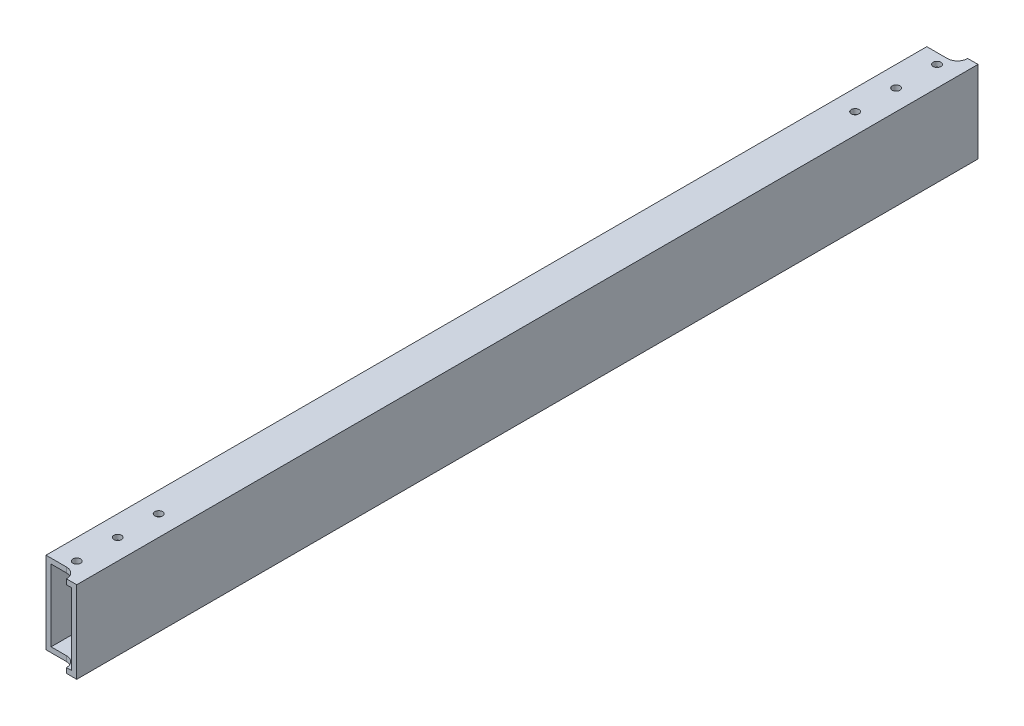
ISO-10303-21;
HEADER;
FILE_DESCRIPTION(('STEP AP214'),'2;1');
FILE_NAME('part.step','',(''),(''),'','','');
FILE_SCHEMA(('AUTOMOTIVE_DESIGN { 1 0 10303 214 1 1 1 1 }'));
ENDSEC;
DATA;
#1=APPLICATION_CONTEXT('core data for automotive mechanical design processes');
#2=APPLICATION_PROTOCOL_DEFINITION('international standard','automotive_design',2000,#1);
#3=PRODUCT_CONTEXT('',#1,'mechanical');
#4=PRODUCT('Part','Part','',(#3));
#5=PRODUCT_RELATED_PRODUCT_CATEGORY('part','',(#4));
#6=PRODUCT_DEFINITION_FORMATION('','',#4);
#7=PRODUCT_DEFINITION_CONTEXT('part definition',#1,'design');
#8=PRODUCT_DEFINITION('design','',#6,#7);
#9=PRODUCT_DEFINITION_SHAPE('','',#8);
#10=(LENGTH_UNIT() NAMED_UNIT(*) SI_UNIT(.MILLI.,.METRE.));
#11=(NAMED_UNIT(*) PLANE_ANGLE_UNIT() SI_UNIT($,.RADIAN.));
#12=(NAMED_UNIT(*) SI_UNIT($,.STERADIAN.) SOLID_ANGLE_UNIT());
#13=UNCERTAINTY_MEASURE_WITH_UNIT(LENGTH_MEASURE(1.E-05),#10,'distance_accuracy_value','');
#14=(GEOMETRIC_REPRESENTATION_CONTEXT(3) GLOBAL_UNCERTAINTY_ASSIGNED_CONTEXT((#13)) GLOBAL_UNIT_ASSIGNED_CONTEXT((#10,
#11,#12)) REPRESENTATION_CONTEXT('',''));
#15=CARTESIAN_POINT('',(0.,0.,0.));
#16=DIRECTION('',(0.,0.,1.));
#17=DIRECTION('',(1.,0.,0.));
#18=AXIS2_PLACEMENT_3D('',#15,#16,#17);
#19=CARTESIAN_POINT('',(12.7,25.4,279.4));
#20=DIRECTION('',(-1.,0.,0.));
#21=DIRECTION('',(0.,0.,1.));
#22=AXIS2_PLACEMENT_3D('',#19,#20,#21);
#23=PLANE('',#22);
#24=DIRECTION('',(0.,1.,0.));
#25=VECTOR('',#24,1.);
#26=CARTESIAN_POINT('',(12.7,25.4,-279.4));
#27=LINE('',#26,#25);
#28=CARTESIAN_POINT('',(12.7,-25.4,-279.4));
#29=VERTEX_POINT('',#28);
#30=CARTESIAN_POINT('',(12.7,25.4,-279.4));
#31=VERTEX_POINT('',#30);
#32=EDGE_CURVE('E181',#29,#31,#27,.T.);
#33=ORIENTED_EDGE('',*,*,#32,.T.);
#34=DIRECTION('',(0.,0.,-1.));
#35=VECTOR('',#34,1.);
#36=CARTESIAN_POINT('',(12.7,25.4,279.4));
#37=LINE('',#36,#35);
#38=CARTESIAN_POINT('',(12.7,25.4,279.4));
#39=VERTEX_POINT('',#38);
#40=EDGE_CURVE('E178',#39,#31,#37,.T.);
#41=ORIENTED_EDGE('',*,*,#40,.F.);
#42=DIRECTION('',(0.,1.,0.));
#43=VECTOR('',#42,1.);
#44=CARTESIAN_POINT('',(12.7,25.4,279.4));
#45=LINE('',#44,#43);
#46=CARTESIAN_POINT('',(12.7,-25.4,279.4));
#47=VERTEX_POINT('',#46);
#48=EDGE_CURVE('E183',#47,#39,#45,.T.);
#49=ORIENTED_EDGE('',*,*,#48,.F.);
#50=DIRECTION('',(0.,0.,-1.));
#51=VECTOR('',#50,1.);
#52=CARTESIAN_POINT('',(12.7,-25.4,279.4));
#53=LINE('',#52,#51);
#54=EDGE_CURVE('E189',#47,#29,#53,.T.);
#55=ORIENTED_EDGE('',*,*,#54,.T.);
#56=EDGE_LOOP('',(#33,#41,#49,#55));
#57=FACE_BOUND('',#56,.T.);
#58=ADVANCED_FACE('F39',(#57),#23,.F.);
#59=CARTESIAN_POINT('',(-12.7,25.4,279.4));
#60=DIRECTION('',(0.,-1.,0.));
#61=DIRECTION('',(0.,0.,-1.));
#62=AXIS2_PLACEMENT_3D('',#59,#60,#61);
#63=PLANE('',#62);
#64=CARTESIAN_POINT('',(0.,25.4,241.3));
#65=DIRECTION('',(0.,1.,0.));
#66=DIRECTION('',(0.,0.,-1.));
#67=AXIS2_PLACEMENT_3D('',#64,#65,#66);
#68=CIRCLE('',#67,2.38125000000003);
#69=CARTESIAN_POINT('',(0.,25.4,238.91875));
#70=VERTEX_POINT('',#69);
#71=EDGE_CURVE('E326',#70,#70,#68,.T.);
#72=ORIENTED_EDGE('',*,*,#71,.F.);
#73=EDGE_LOOP('',(#72));
#74=FACE_BOUND('',#73,.T.);
#75=CARTESIAN_POINT('',(0.,25.4,266.7));
#76=DIRECTION('',(0.,1.,0.));
#77=DIRECTION('',(0.,0.,-1.));
#78=AXIS2_PLACEMENT_3D('',#75,#76,#77);
#79=CIRCLE('',#78,2.38125000000004);
#80=CARTESIAN_POINT('',(0.,25.4,264.31875));
#81=VERTEX_POINT('',#80);
#82=EDGE_CURVE('E327',#81,#81,#79,.T.);
#83=ORIENTED_EDGE('',*,*,#82,.F.);
#84=EDGE_LOOP('',(#83));
#85=FACE_BOUND('',#84,.T.);
#86=CARTESIAN_POINT('',(0.,25.4,215.9));
#87=DIRECTION('',(0.,1.,0.));
#88=DIRECTION('',(0.,0.,-1.));
#89=AXIS2_PLACEMENT_3D('',#86,#87,#88);
#90=CIRCLE('',#89,2.38125000000001);
#91=CARTESIAN_POINT('',(0.,25.4,213.51875));
#92=VERTEX_POINT('',#91);
#93=EDGE_CURVE('E355',#92,#92,#90,.T.);
#94=ORIENTED_EDGE('',*,*,#93,.F.);
#95=EDGE_LOOP('',(#94));
#96=FACE_BOUND('',#95,.T.);
#97=CARTESIAN_POINT('',(0.,25.4,-215.9));
#98=DIRECTION('',(0.,1.,0.));
#99=DIRECTION('',(0.,0.,1.));
#100=AXIS2_PLACEMENT_3D('',#97,#98,#99);
#101=CIRCLE('',#100,2.38125000000001);
#102=CARTESIAN_POINT('',(0.,25.4,-213.51875));
#103=VERTEX_POINT('',#102);
#104=EDGE_CURVE('E361',#103,#103,#101,.T.);
#105=ORIENTED_EDGE('',*,*,#104,.F.);
#106=EDGE_LOOP('',(#105));
#107=FACE_BOUND('',#106,.T.);
#108=CARTESIAN_POINT('',(0.,25.4,-241.3));
#109=DIRECTION('',(0.,1.,0.));
#110=DIRECTION('',(0.,0.,1.));
#111=AXIS2_PLACEMENT_3D('',#108,#109,#110);
#112=CIRCLE('',#111,2.38125000000003);
#113=CARTESIAN_POINT('',(0.,25.4,-238.91875));
#114=VERTEX_POINT('',#113);
#115=EDGE_CURVE('E173',#114,#114,#112,.T.);
#116=ORIENTED_EDGE('',*,*,#115,.F.);
#117=EDGE_LOOP('',(#116));
#118=FACE_BOUND('',#117,.T.);
#119=CARTESIAN_POINT('',(0.,25.4,-266.7));
#120=DIRECTION('',(0.,1.,0.));
#121=DIRECTION('',(0.,0.,1.));
#122=AXIS2_PLACEMENT_3D('',#119,#120,#121);
#123=CIRCLE('',#122,2.38125000000004);
#124=CARTESIAN_POINT('',(0.,25.4,-264.31875));
#125=VERTEX_POINT('',#124);
#126=EDGE_CURVE('E318',#125,#125,#123,.T.);
#127=ORIENTED_EDGE('',*,*,#126,.F.);
#128=EDGE_LOOP('',(#127));
#129=FACE_BOUND('',#128,.T.);
#130=DIRECTION('',(-1.,0.,0.));
#131=VECTOR('',#130,1.);
#132=CARTESIAN_POINT('',(-12.7,25.4,273.05));
#133=LINE('',#132,#131);
#134=CARTESIAN_POINT('',(0.,25.4,273.05));
#135=VERTEX_POINT('',#134);
#136=CARTESIAN_POINT('',(-12.7,25.4,273.05));
#137=VERTEX_POINT('',#136);
#138=EDGE_CURVE('E333',#135,#137,#133,.T.);
#139=ORIENTED_EDGE('',*,*,#138,.F.);
#140=CARTESIAN_POINT('',(0.,25.4,279.4));
#141=DIRECTION('',(0.,1.,0.));
#142=DIRECTION('',(0.,0.,1.));
#143=AXIS2_PLACEMENT_3D('',#140,#141,#142);
#144=CIRCLE('',#143,6.35000000000001);
#145=CARTESIAN_POINT('',(6.35,25.4,279.4));
#146=VERTEX_POINT('',#145);
#147=EDGE_CURVE('E337',#146,#135,#144,.T.);
#148=ORIENTED_EDGE('',*,*,#147,.F.);
#149=DIRECTION('',(-1.,0.,0.));
#150=VECTOR('',#149,1.);
#151=CARTESIAN_POINT('',(-12.7,25.4,279.4));
#152=LINE('',#151,#150);
#153=EDGE_CURVE('E270',#39,#146,#152,.T.);
#154=ORIENTED_EDGE('',*,*,#153,.F.);
#155=ORIENTED_EDGE('',*,*,#40,.T.);
#156=DIRECTION('',(-1.,0.,0.));
#157=VECTOR('',#156,1.);
#158=CARTESIAN_POINT('',(-12.7,25.4,-279.4));
#159=LINE('',#158,#157);
#160=CARTESIAN_POINT('',(6.35,25.4,-279.4));
#161=VERTEX_POINT('',#160);
#162=EDGE_CURVE('E168',#31,#161,#159,.T.);
#163=ORIENTED_EDGE('',*,*,#162,.T.);
#164=CARTESIAN_POINT('',(0.,25.4,-279.4));
#165=DIRECTION('',(0.,1.,0.));
#166=DIRECTION('',(0.,0.,-1.));
#167=AXIS2_PLACEMENT_3D('',#164,#165,#166);
#168=CIRCLE('',#167,6.35000000000001);
#169=CARTESIAN_POINT('',(0.,25.4,-273.05));
#170=VERTEX_POINT('',#169);
#171=EDGE_CURVE('E149',#170,#161,#168,.T.);
#172=ORIENTED_EDGE('',*,*,#171,.F.);
#173=DIRECTION('',(1.,0.,0.));
#174=VECTOR('',#173,1.);
#175=CARTESIAN_POINT('',(-12.7,25.4,-273.05));
#176=LINE('',#175,#174);
#177=CARTESIAN_POINT('',(-12.7,25.4,-273.05));
#178=VERTEX_POINT('',#177);
#179=EDGE_CURVE('E160',#178,#170,#176,.T.);
#180=ORIENTED_EDGE('',*,*,#179,.F.);
#181=DIRECTION('',(0.,0.,-1.));
#182=VECTOR('',#181,1.);
#183=CARTESIAN_POINT('',(-12.7,25.4,279.4));
#184=LINE('',#183,#182);
#185=EDGE_CURVE('E196',#137,#178,#184,.T.);
#186=ORIENTED_EDGE('',*,*,#185,.F.);
#187=EDGE_LOOP('',(#139,#148,#154,#155,#163,#172,#180,#186));
#188=FACE_BOUND('',#187,.T.);
#189=ADVANCED_FACE('F176',(#74,#85,#96,#107,#118,#129,#188),#63,.F.);
#190=CARTESIAN_POINT('',(-12.7,25.4,279.4));
#191=DIRECTION('',(1.,0.,0.));
#192=DIRECTION('',(0.,0.,-1.));
#193=AXIS2_PLACEMENT_3D('',#190,#191,#192);
#194=PLANE('',#193);
#195=DIRECTION('',(0.,0.,-1.));
#196=VECTOR('',#195,1.);
#197=CARTESIAN_POINT('',(-12.7,-25.4,279.4));
#198=LINE('',#197,#196);
#199=CARTESIAN_POINT('',(-12.7,-25.4,273.05));
#200=VERTEX_POINT('',#199);
#201=CARTESIAN_POINT('',(-12.7,-25.4,-273.05));
#202=VERTEX_POINT('',#201);
#203=EDGE_CURVE('E192',#200,#202,#198,.T.);
#204=ORIENTED_EDGE('',*,*,#203,.F.);
#205=DIRECTION('',(0.,1.,0.));
#206=VECTOR('',#205,1.);
#207=CARTESIAN_POINT('',(-12.7,-25.4,273.05));
#208=LINE('',#207,#206);
#209=EDGE_CURVE('E343',#200,#137,#208,.T.);
#210=ORIENTED_EDGE('',*,*,#209,.T.);
#211=ORIENTED_EDGE('',*,*,#185,.T.);
#212=DIRECTION('',(0.,1.,0.));
#213=VECTOR('',#212,1.);
#214=CARTESIAN_POINT('',(-12.7,-25.4,-273.05));
#215=LINE('',#214,#213);
#216=EDGE_CURVE('E373',#202,#178,#215,.T.);
#217=ORIENTED_EDGE('',*,*,#216,.F.);
#218=EDGE_LOOP('',(#204,#210,#211,#217));
#219=FACE_BOUND('',#218,.T.);
#220=ADVANCED_FACE('F383',(#219),#194,.F.);
#221=CARTESIAN_POINT('',(-12.7,-25.4,279.4));
#222=DIRECTION('',(0.,1.,0.));
#223=DIRECTION('',(0.,0.,1.));
#224=AXIS2_PLACEMENT_3D('',#221,#222,#223);
#225=PLANE('',#224);
#226=CARTESIAN_POINT('',(0.,-25.4,241.3));
#227=DIRECTION('',(0.,1.,0.));
#228=DIRECTION('',(0.,0.,-1.));
#229=AXIS2_PLACEMENT_3D('',#226,#227,#228);
#230=CIRCLE('',#229,2.38125000000003);
#231=CARTESIAN_POINT('',(0.,-25.4,238.91875));
#232=VERTEX_POINT('',#231);
#233=EDGE_CURVE('E323',#232,#232,#230,.T.);
#234=ORIENTED_EDGE('',*,*,#233,.T.);
#235=EDGE_LOOP('',(#234));
#236=FACE_BOUND('',#235,.T.);
#237=CARTESIAN_POINT('',(0.,-25.4,266.7));
#238=DIRECTION('',(0.,1.,0.));
#239=DIRECTION('',(0.,0.,-1.));
#240=AXIS2_PLACEMENT_3D('',#237,#238,#239);
#241=CIRCLE('',#240,2.38125000000004);
#242=CARTESIAN_POINT('',(0.,-25.4,264.31875));
#243=VERTEX_POINT('',#242);
#244=EDGE_CURVE('E348',#243,#243,#241,.T.);
#245=ORIENTED_EDGE('',*,*,#244,.T.);
#246=EDGE_LOOP('',(#245));
#247=FACE_BOUND('',#246,.T.);
#248=CARTESIAN_POINT('',(0.,-25.4,215.9));
#249=DIRECTION('',(0.,1.,0.));
#250=DIRECTION('',(0.,0.,-1.));
#251=AXIS2_PLACEMENT_3D('',#248,#249,#250);
#252=CIRCLE('',#251,2.38125000000001);
#253=CARTESIAN_POINT('',(0.,-25.4,213.51875));
#254=VERTEX_POINT('',#253);
#255=EDGE_CURVE('E340',#254,#254,#252,.T.);
#256=ORIENTED_EDGE('',*,*,#255,.T.);
#257=EDGE_LOOP('',(#256));
#258=FACE_BOUND('',#257,.T.);
#259=CARTESIAN_POINT('',(0.,-25.4,-215.9));
#260=DIRECTION('',(0.,1.,0.));
#261=DIRECTION('',(0.,0.,1.));
#262=AXIS2_PLACEMENT_3D('',#259,#260,#261);
#263=CIRCLE('',#262,2.38125000000001);
#264=CARTESIAN_POINT('',(0.,-25.4,-213.51875));
#265=VERTEX_POINT('',#264);
#266=EDGE_CURVE('E358',#265,#265,#263,.T.);
#267=ORIENTED_EDGE('',*,*,#266,.T.);
#268=EDGE_LOOP('',(#267));
#269=FACE_BOUND('',#268,.T.);
#270=CARTESIAN_POINT('',(0.,-25.4,-241.3));
#271=DIRECTION('',(0.,1.,0.));
#272=DIRECTION('',(0.,0.,1.));
#273=AXIS2_PLACEMENT_3D('',#270,#271,#272);
#274=CIRCLE('',#273,2.38125000000003);
#275=CARTESIAN_POINT('',(0.,-25.4,-238.91875));
#276=VERTEX_POINT('',#275);
#277=EDGE_CURVE('E364',#276,#276,#274,.T.);
#278=ORIENTED_EDGE('',*,*,#277,.T.);
#279=EDGE_LOOP('',(#278));
#280=FACE_BOUND('',#279,.T.);
#281=CARTESIAN_POINT('',(0.,-25.4,-266.7));
#282=DIRECTION('',(0.,1.,0.));
#283=DIRECTION('',(0.,0.,1.));
#284=AXIS2_PLACEMENT_3D('',#281,#282,#283);
#285=CIRCLE('',#284,2.38125000000004);
#286=CARTESIAN_POINT('',(0.,-25.4,-264.31875));
#287=VERTEX_POINT('',#286);
#288=EDGE_CURVE('E205',#287,#287,#285,.T.);
#289=ORIENTED_EDGE('',*,*,#288,.T.);
#290=EDGE_LOOP('',(#289));
#291=FACE_BOUND('',#290,.T.);
#292=DIRECTION('',(1.,0.,0.));
#293=VECTOR('',#292,1.);
#294=CARTESIAN_POINT('',(-12.7,-25.4,279.4));
#295=LINE('',#294,#293);
#296=CARTESIAN_POINT('',(6.35,-25.4,279.4));
#297=VERTEX_POINT('',#296);
#298=EDGE_CURVE('E193',#297,#47,#295,.T.);
#299=ORIENTED_EDGE('',*,*,#298,.F.);
#300=CARTESIAN_POINT('',(0.,-25.4,279.4));
#301=DIRECTION('',(0.,1.,0.));
#302=DIRECTION('',(0.,0.,1.));
#303=AXIS2_PLACEMENT_3D('',#300,#301,#302);
#304=CIRCLE('',#303,6.35000000000001);
#305=CARTESIAN_POINT('',(0.,-25.4,273.05));
#306=VERTEX_POINT('',#305);
#307=EDGE_CURVE('E331',#297,#306,#304,.T.);
#308=ORIENTED_EDGE('',*,*,#307,.T.);
#309=DIRECTION('',(-1.,0.,0.));
#310=VECTOR('',#309,1.);
#311=CARTESIAN_POINT('',(-12.7,-25.4,273.05));
#312=LINE('',#311,#310);
#313=EDGE_CURVE('E334',#306,#200,#312,.T.);
#314=ORIENTED_EDGE('',*,*,#313,.T.);
#315=ORIENTED_EDGE('',*,*,#203,.T.);
#316=DIRECTION('',(1.,0.,0.));
#317=VECTOR('',#316,1.);
#318=CARTESIAN_POINT('',(-12.7,-25.4,-273.05));
#319=LINE('',#318,#317);
#320=CARTESIAN_POINT('',(0.,-25.4,-273.05));
#321=VERTEX_POINT('',#320);
#322=EDGE_CURVE('E161',#202,#321,#319,.T.);
#323=ORIENTED_EDGE('',*,*,#322,.T.);
#324=CARTESIAN_POINT('',(0.,-25.4,-279.4));
#325=DIRECTION('',(0.,1.,0.));
#326=DIRECTION('',(0.,0.,-1.));
#327=AXIS2_PLACEMENT_3D('',#324,#325,#326);
#328=CIRCLE('',#327,6.35000000000001);
#329=CARTESIAN_POINT('',(6.35,-25.4,-279.4));
#330=VERTEX_POINT('',#329);
#331=EDGE_CURVE('E371',#321,#330,#328,.T.);
#332=ORIENTED_EDGE('',*,*,#331,.T.);
#333=DIRECTION('',(1.,0.,0.));
#334=VECTOR('',#333,1.);
#335=CARTESIAN_POINT('',(-12.7,-25.4,-279.4));
#336=LINE('',#335,#334);
#337=EDGE_CURVE('E180',#330,#29,#336,.T.);
#338=ORIENTED_EDGE('',*,*,#337,.T.);
#339=ORIENTED_EDGE('',*,*,#54,.F.);
#340=EDGE_LOOP('',(#299,#308,#314,#315,#323,#332,#338,#339));
#341=FACE_BOUND('',#340,.T.);
#342=ADVANCED_FACE('F282',(#236,#247,#258,#269,#280,#291,#341),#225,.F.);
#343=CARTESIAN_POINT('',(0.,0.,279.4));
#344=DIRECTION('',(0.,0.,1.));
#345=DIRECTION('',(1.,0.,0.));
#346=AXIS2_PLACEMENT_3D('',#343,#344,#345);
#347=PLANE('',#346);
#348=DIRECTION('',(0.,1.,0.));
#349=VECTOR('',#348,1.);
#350=CARTESIAN_POINT('',(6.35,-25.4,279.4));
#351=LINE('',#350,#349);
#352=CARTESIAN_POINT('',(6.35,-22.225,279.4));
#353=VERTEX_POINT('',#352);
#354=EDGE_CURVE('E279',#297,#353,#351,.T.);
#355=ORIENTED_EDGE('',*,*,#354,.F.);
#356=ORIENTED_EDGE('',*,*,#298,.T.);
#357=ORIENTED_EDGE('',*,*,#48,.T.);
#358=ORIENTED_EDGE('',*,*,#153,.T.);
#359=CARTESIAN_POINT('',(6.35,22.225,279.4));
#360=VERTEX_POINT('',#359);
#361=EDGE_CURVE('E330',#360,#146,#351,.T.);
#362=ORIENTED_EDGE('',*,*,#361,.F.);
#363=DIRECTION('',(-1.,0.,0.));
#364=VECTOR('',#363,1.);
#365=CARTESIAN_POINT('',(-12.7,22.225,279.4));
#366=LINE('',#365,#364);
#367=CARTESIAN_POINT('',(9.52500000000001,22.225,279.4));
#368=VERTEX_POINT('',#367);
#369=EDGE_CURVE('E264',#368,#360,#366,.T.);
#370=ORIENTED_EDGE('',*,*,#369,.F.);
#371=DIRECTION('',(0.,1.,0.));
#372=VECTOR('',#371,1.);
#373=CARTESIAN_POINT('',(9.52500000000001,25.4,279.4));
#374=LINE('',#373,#372);
#375=CARTESIAN_POINT('',(9.52500000000001,-22.225,279.4));
#376=VERTEX_POINT('',#375);
#377=EDGE_CURVE('E261',#376,#368,#374,.T.);
#378=ORIENTED_EDGE('',*,*,#377,.F.);
#379=DIRECTION('',(1.,0.,0.));
#380=VECTOR('',#379,1.);
#381=CARTESIAN_POINT('',(-12.7,-22.225,279.4));
#382=LINE('',#381,#380);
#383=EDGE_CURVE('E253',#353,#376,#382,.T.);
#384=ORIENTED_EDGE('',*,*,#383,.F.);
#385=EDGE_LOOP('',(#355,#356,#357,#358,#362,#370,#378,#384));
#386=FACE_BOUND('',#385,.T.);
#387=ADVANCED_FACE('F276',(#386),#347,.T.);
#388=CARTESIAN_POINT('',(0.,0.,-279.4));
#389=DIRECTION('',(0.,0.,1.));
#390=DIRECTION('',(1.,0.,0.));
#391=AXIS2_PLACEMENT_3D('',#388,#389,#390);
#392=PLANE('',#391);
#393=ORIENTED_EDGE('',*,*,#337,.F.);
#394=DIRECTION('',(0.,1.,0.));
#395=VECTOR('',#394,1.);
#396=CARTESIAN_POINT('',(6.35,-25.4,-279.4));
#397=LINE('',#396,#395);
#398=CARTESIAN_POINT('',(6.35,-22.225,-279.4));
#399=VERTEX_POINT('',#398);
#400=EDGE_CURVE('E172',#330,#399,#397,.T.);
#401=ORIENTED_EDGE('',*,*,#400,.T.);
#402=DIRECTION('',(1.,0.,0.));
#403=VECTOR('',#402,1.);
#404=CARTESIAN_POINT('',(-12.7,-22.225,-279.4));
#405=LINE('',#404,#403);
#406=CARTESIAN_POINT('',(9.52500000000001,-22.225,-279.4));
#407=VERTEX_POINT('',#406);
#408=EDGE_CURVE('E259',#399,#407,#405,.T.);
#409=ORIENTED_EDGE('',*,*,#408,.T.);
#410=DIRECTION('',(0.,1.,0.));
#411=VECTOR('',#410,1.);
#412=CARTESIAN_POINT('',(9.52500000000001,25.4,-279.4));
#413=LINE('',#412,#411);
#414=CARTESIAN_POINT('',(9.52500000000001,22.225,-279.4));
#415=VERTEX_POINT('',#414);
#416=EDGE_CURVE('E256',#407,#415,#413,.T.);
#417=ORIENTED_EDGE('',*,*,#416,.T.);
#418=DIRECTION('',(-1.,0.,0.));
#419=VECTOR('',#418,1.);
#420=CARTESIAN_POINT('',(-12.7,22.225,-279.4));
#421=LINE('',#420,#419);
#422=CARTESIAN_POINT('',(6.35,22.225,-279.4));
#423=VERTEX_POINT('',#422);
#424=EDGE_CURVE('E171',#415,#423,#421,.T.);
#425=ORIENTED_EDGE('',*,*,#424,.T.);
#426=EDGE_CURVE('E152',#423,#161,#397,.T.);
#427=ORIENTED_EDGE('',*,*,#426,.T.);
#428=ORIENTED_EDGE('',*,*,#162,.F.);
#429=ORIENTED_EDGE('',*,*,#32,.F.);
#430=EDGE_LOOP('',(#393,#401,#409,#417,#425,#427,#428,#429));
#431=FACE_BOUND('',#430,.T.);
#432=ADVANCED_FACE('F166',(#431),#392,.F.);
#433=CARTESIAN_POINT('',(9.52500000000001,25.4,279.4));
#434=DIRECTION('',(-1.,0.,0.));
#435=DIRECTION('',(0.,0.,1.));
#436=AXIS2_PLACEMENT_3D('',#433,#434,#435);
#437=PLANE('',#436);
#438=ORIENTED_EDGE('',*,*,#416,.F.);
#439=DIRECTION('',(0.,0.,-1.));
#440=VECTOR('',#439,1.);
#441=CARTESIAN_POINT('',(9.52500000000001,-22.225,279.4));
#442=LINE('',#441,#440);
#443=EDGE_CURVE('E249',#376,#407,#442,.T.);
#444=ORIENTED_EDGE('',*,*,#443,.F.);
#445=ORIENTED_EDGE('',*,*,#377,.T.);
#446=DIRECTION('',(0.,0.,-1.));
#447=VECTOR('',#446,1.);
#448=CARTESIAN_POINT('',(9.525,22.225,279.4));
#449=LINE('',#448,#447);
#450=EDGE_CURVE('E185',#368,#415,#449,.T.);
#451=ORIENTED_EDGE('',*,*,#450,.T.);
#452=EDGE_LOOP('',(#438,#444,#445,#451));
#453=FACE_BOUND('',#452,.T.);
#454=ADVANCED_FACE('F294',(#453),#437,.T.);
#455=CARTESIAN_POINT('',(-12.7,22.225,279.4));
#456=DIRECTION('',(0.,-1.,0.));
#457=DIRECTION('',(0.,0.,-1.));
#458=AXIS2_PLACEMENT_3D('',#455,#456,#457);
#459=PLANE('',#458);
#460=CARTESIAN_POINT('',(0.,22.225,279.4));
#461=DIRECTION('',(0.,-1.,0.));
#462=DIRECTION('',(0.,0.,-1.));
#463=AXIS2_PLACEMENT_3D('',#460,#461,#462);
#464=CIRCLE('',#463,6.35000000000001);
#465=CARTESIAN_POINT('',(0.,22.225,273.05));
#466=VERTEX_POINT('',#465);
#467=EDGE_CURVE('E258',#466,#360,#464,.T.);
#468=ORIENTED_EDGE('',*,*,#467,.F.);
#469=DIRECTION('',(1.,0.,0.));
#470=VECTOR('',#469,1.);
#471=CARTESIAN_POINT('',(-12.7,22.225,273.05));
#472=LINE('',#471,#470);
#473=CARTESIAN_POINT('',(-9.52500000000001,22.225,273.05));
#474=VERTEX_POINT('',#473);
#475=EDGE_CURVE('E244',#474,#466,#472,.T.);
#476=ORIENTED_EDGE('',*,*,#475,.F.);
#477=DIRECTION('',(0.,0.,-1.));
#478=VECTOR('',#477,1.);
#479=CARTESIAN_POINT('',(-9.52500000000001,22.225,279.4));
#480=LINE('',#479,#478);
#481=CARTESIAN_POINT('',(-9.52500000000001,22.225,-273.05));
#482=VERTEX_POINT('',#481);
#483=EDGE_CURVE('E243',#474,#482,#480,.T.);
#484=ORIENTED_EDGE('',*,*,#483,.T.);
#485=DIRECTION('',(-1.,0.,0.));
#486=VECTOR('',#485,1.);
#487=CARTESIAN_POINT('',(-12.7,22.225,-273.05));
#488=LINE('',#487,#486);
#489=CARTESIAN_POINT('',(0.,22.225,-273.05));
#490=VERTEX_POINT('',#489);
#491=EDGE_CURVE('E313',#490,#482,#488,.T.);
#492=ORIENTED_EDGE('',*,*,#491,.F.);
#493=CARTESIAN_POINT('',(0.,22.225,-279.4));
#494=DIRECTION('',(0.,-1.,0.));
#495=DIRECTION('',(0.,0.,-1.));
#496=AXIS2_PLACEMENT_3D('',#493,#494,#495);
#497=CIRCLE('',#496,6.35000000000001);
#498=EDGE_CURVE('E213',#423,#490,#497,.T.);
#499=ORIENTED_EDGE('',*,*,#498,.F.);
#500=ORIENTED_EDGE('',*,*,#424,.F.);
#501=ORIENTED_EDGE('',*,*,#450,.F.);
#502=ORIENTED_EDGE('',*,*,#369,.T.);
#503=EDGE_LOOP('',(#468,#476,#484,#492,#499,#500,#501,#502));
#504=FACE_BOUND('',#503,.T.);
#505=CARTESIAN_POINT('',(0.,22.225,241.3));
#506=DIRECTION('',(0.,-1.,0.));
#507=DIRECTION('',(0.,0.,-1.));
#508=AXIS2_PLACEMENT_3D('',#505,#506,#507);
#509=CIRCLE('',#508,2.38125000000003);
#510=CARTESIAN_POINT('',(0.,22.225,238.91875));
#511=VERTEX_POINT('',#510);
#512=EDGE_CURVE('E228',#511,#511,#509,.T.);
#513=ORIENTED_EDGE('',*,*,#512,.F.);
#514=EDGE_LOOP('',(#513));
#515=FACE_BOUND('',#514,.T.);
#516=CARTESIAN_POINT('',(0.,22.225,266.7));
#517=DIRECTION('',(0.,-1.,0.));
#518=DIRECTION('',(0.,0.,-1.));
#519=AXIS2_PLACEMENT_3D('',#516,#517,#518);
#520=CIRCLE('',#519,2.38125000000004);
#521=CARTESIAN_POINT('',(0.,22.225,264.31875));
#522=VERTEX_POINT('',#521);
#523=EDGE_CURVE('E225',#522,#522,#520,.T.);
#524=ORIENTED_EDGE('',*,*,#523,.F.);
#525=EDGE_LOOP('',(#524));
#526=FACE_BOUND('',#525,.T.);
#527=CARTESIAN_POINT('',(0.,22.225,215.9));
#528=DIRECTION('',(0.,-1.,0.));
#529=DIRECTION('',(0.,0.,-1.));
#530=AXIS2_PLACEMENT_3D('',#527,#528,#529);
#531=CIRCLE('',#530,2.38125000000001);
#532=CARTESIAN_POINT('',(0.,22.225,213.51875));
#533=VERTEX_POINT('',#532);
#534=EDGE_CURVE('E221',#533,#533,#531,.T.);
#535=ORIENTED_EDGE('',*,*,#534,.F.);
#536=EDGE_LOOP('',(#535));
#537=FACE_BOUND('',#536,.T.);
#538=CARTESIAN_POINT('',(0.,22.225,-215.9));
#539=DIRECTION('',(0.,-1.,0.));
#540=DIRECTION('',(0.,0.,-1.));
#541=AXIS2_PLACEMENT_3D('',#538,#539,#540);
#542=CIRCLE('',#541,2.38125000000001);
#543=CARTESIAN_POINT('',(0.,22.225,-218.28125));
#544=VERTEX_POINT('',#543);
#545=EDGE_CURVE('E217',#544,#544,#542,.T.);
#546=ORIENTED_EDGE('',*,*,#545,.F.);
#547=EDGE_LOOP('',(#546));
#548=FACE_BOUND('',#547,.T.);
#549=CARTESIAN_POINT('',(0.,22.225,-241.3));
#550=DIRECTION('',(0.,-1.,0.));
#551=DIRECTION('',(0.,0.,-1.));
#552=AXIS2_PLACEMENT_3D('',#549,#550,#551);
#553=CIRCLE('',#552,2.38125000000003);
#554=CARTESIAN_POINT('',(0.,22.225,-243.68125));
#555=VERTEX_POINT('',#554);
#556=EDGE_CURVE('E212',#555,#555,#553,.T.);
#557=ORIENTED_EDGE('',*,*,#556,.F.);
#558=EDGE_LOOP('',(#557));
#559=FACE_BOUND('',#558,.T.);
#560=CARTESIAN_POINT('',(0.,22.225,-266.7));
#561=DIRECTION('',(0.,-1.,0.));
#562=DIRECTION('',(0.,0.,-1.));
#563=AXIS2_PLACEMENT_3D('',#560,#561,#562);
#564=CIRCLE('',#563,2.38125000000004);
#565=CARTESIAN_POINT('',(0.,22.225,-269.08125));
#566=VERTEX_POINT('',#565);
#567=EDGE_CURVE('E204',#566,#566,#564,.T.);
#568=ORIENTED_EDGE('',*,*,#567,.F.);
#569=EDGE_LOOP('',(#568));
#570=FACE_BOUND('',#569,.T.);
#571=ADVANCED_FACE('F388',(#504,#515,#526,#537,#548,#559,#570),#459,.T.);
#572=CARTESIAN_POINT('',(-9.52500000000001,25.4,279.4));
#573=DIRECTION('',(1.,0.,0.));
#574=DIRECTION('',(0.,0.,-1.));
#575=AXIS2_PLACEMENT_3D('',#572,#573,#574);
#576=PLANE('',#575);
#577=DIRECTION('',(0.,1.,0.));
#578=VECTOR('',#577,1.);
#579=CARTESIAN_POINT('',(-9.52500000000001,25.4,273.05));
#580=LINE('',#579,#578);
#581=CARTESIAN_POINT('',(-9.52500000000001,-22.225,273.05));
#582=VERTEX_POINT('',#581);
#583=EDGE_CURVE('E232',#582,#474,#580,.T.);
#584=ORIENTED_EDGE('',*,*,#583,.F.);
#585=DIRECTION('',(0.,0.,-1.));
#586=VECTOR('',#585,1.);
#587=CARTESIAN_POINT('',(-9.52500000000001,-22.225,279.4));
#588=LINE('',#587,#586);
#589=CARTESIAN_POINT('',(-9.52500000000001,-22.225,-273.05));
#590=VERTEX_POINT('',#589);
#591=EDGE_CURVE('E241',#582,#590,#588,.T.);
#592=ORIENTED_EDGE('',*,*,#591,.T.);
#593=DIRECTION('',(0.,-1.,0.));
#594=VECTOR('',#593,1.);
#595=CARTESIAN_POINT('',(-9.52500000000001,25.4,-273.05));
#596=LINE('',#595,#594);
#597=EDGE_CURVE('E60',#482,#590,#596,.T.);
#598=ORIENTED_EDGE('',*,*,#597,.F.);
#599=ORIENTED_EDGE('',*,*,#483,.F.);
#600=EDGE_LOOP('',(#584,#592,#598,#599));
#601=FACE_BOUND('',#600,.T.);
#602=ADVANCED_FACE('F240',(#601),#576,.T.);
#603=CARTESIAN_POINT('',(-12.7,-22.225,279.4));
#604=DIRECTION('',(0.,1.,0.));
#605=DIRECTION('',(0.,0.,1.));
#606=AXIS2_PLACEMENT_3D('',#603,#604,#605);
#607=PLANE('',#606);
#608=CARTESIAN_POINT('',(0.,-22.225,279.4));
#609=DIRECTION('',(0.,1.,0.));
#610=DIRECTION('',(0.,0.,1.));
#611=AXIS2_PLACEMENT_3D('',#608,#609,#610);
#612=CIRCLE('',#611,6.35000000000001);
#613=CARTESIAN_POINT('',(0.,-22.225,273.05));
#614=VERTEX_POINT('',#613);
#615=EDGE_CURVE('E11',#353,#614,#612,.T.);
#616=ORIENTED_EDGE('',*,*,#615,.F.);
#617=ORIENTED_EDGE('',*,*,#383,.T.);
#618=ORIENTED_EDGE('',*,*,#443,.T.);
#619=ORIENTED_EDGE('',*,*,#408,.F.);
#620=CARTESIAN_POINT('',(0.,-22.225,-279.4));
#621=DIRECTION('',(0.,1.,0.));
#622=DIRECTION('',(0.,0.,1.));
#623=AXIS2_PLACEMENT_3D('',#620,#621,#622);
#624=CIRCLE('',#623,6.35000000000001);
#625=CARTESIAN_POINT('',(0.,-22.225,-273.05));
#626=VERTEX_POINT('',#625);
#627=EDGE_CURVE('E207',#626,#399,#624,.T.);
#628=ORIENTED_EDGE('',*,*,#627,.F.);
#629=DIRECTION('',(1.,0.,0.));
#630=VECTOR('',#629,1.);
#631=CARTESIAN_POINT('',(-12.7,-22.225,-273.05));
#632=LINE('',#631,#630);
#633=EDGE_CURVE('E200',#590,#626,#632,.T.);
#634=ORIENTED_EDGE('',*,*,#633,.F.);
#635=ORIENTED_EDGE('',*,*,#591,.F.);
#636=DIRECTION('',(-1.,0.,0.));
#637=VECTOR('',#636,1.);
#638=CARTESIAN_POINT('',(-12.7,-22.225,273.05));
#639=LINE('',#638,#637);
#640=EDGE_CURVE('E46',#614,#582,#639,.T.);
#641=ORIENTED_EDGE('',*,*,#640,.F.);
#642=EDGE_LOOP('',(#616,#617,#618,#619,#628,#634,#635,#641));
#643=FACE_BOUND('',#642,.T.);
#644=CARTESIAN_POINT('',(0.,-22.225,241.3));
#645=DIRECTION('',(0.,1.,0.));
#646=DIRECTION('',(0.,0.,1.));
#647=AXIS2_PLACEMENT_3D('',#644,#645,#646);
#648=CIRCLE('',#647,2.38125000000003);
#649=CARTESIAN_POINT('',(0.,-22.225,243.68125));
#650=VERTEX_POINT('',#649);
#651=EDGE_CURVE('E226',#650,#650,#648,.T.);
#652=ORIENTED_EDGE('',*,*,#651,.F.);
#653=EDGE_LOOP('',(#652));
#654=FACE_BOUND('',#653,.T.);
#655=CARTESIAN_POINT('',(0.,-22.225,266.7));
#656=DIRECTION('',(0.,1.,0.));
#657=DIRECTION('',(0.,0.,1.));
#658=AXIS2_PLACEMENT_3D('',#655,#656,#657);
#659=CIRCLE('',#658,2.38125000000004);
#660=CARTESIAN_POINT('',(0.,-22.225,269.08125));
#661=VERTEX_POINT('',#660);
#662=EDGE_CURVE('E222',#661,#661,#659,.T.);
#663=ORIENTED_EDGE('',*,*,#662,.F.);
#664=EDGE_LOOP('',(#663));
#665=FACE_BOUND('',#664,.T.);
#666=CARTESIAN_POINT('',(0.,-22.225,215.9));
#667=DIRECTION('',(0.,1.,0.));
#668=DIRECTION('',(0.,0.,1.));
#669=AXIS2_PLACEMENT_3D('',#666,#667,#668);
#670=CIRCLE('',#669,2.38125000000001);
#671=CARTESIAN_POINT('',(0.,-22.225,218.28125));
#672=VERTEX_POINT('',#671);
#673=EDGE_CURVE('E218',#672,#672,#670,.T.);
#674=ORIENTED_EDGE('',*,*,#673,.F.);
#675=EDGE_LOOP('',(#674));
#676=FACE_BOUND('',#675,.T.);
#677=CARTESIAN_POINT('',(0.,-22.225,-215.9));
#678=DIRECTION('',(0.,1.,0.));
#679=DIRECTION('',(0.,0.,1.));
#680=AXIS2_PLACEMENT_3D('',#677,#678,#679);
#681=CIRCLE('',#680,2.38125000000001);
#682=CARTESIAN_POINT('',(0.,-22.225,-213.51875));
#683=VERTEX_POINT('',#682);
#684=EDGE_CURVE('E214',#683,#683,#681,.T.);
#685=ORIENTED_EDGE('',*,*,#684,.F.);
#686=EDGE_LOOP('',(#685));
#687=FACE_BOUND('',#686,.T.);
#688=CARTESIAN_POINT('',(0.,-22.225,-241.3));
#689=DIRECTION('',(0.,1.,0.));
#690=DIRECTION('',(0.,0.,1.));
#691=AXIS2_PLACEMENT_3D('',#688,#689,#690);
#692=CIRCLE('',#691,2.38125000000003);
#693=CARTESIAN_POINT('',(0.,-22.225,-238.91875));
#694=VERTEX_POINT('',#693);
#695=EDGE_CURVE('E209',#694,#694,#692,.T.);
#696=ORIENTED_EDGE('',*,*,#695,.F.);
#697=EDGE_LOOP('',(#696));
#698=FACE_BOUND('',#697,.T.);
#699=CARTESIAN_POINT('',(0.,-22.225,-266.7));
#700=DIRECTION('',(0.,1.,0.));
#701=DIRECTION('',(0.,0.,1.));
#702=AXIS2_PLACEMENT_3D('',#699,#700,#701);
#703=CIRCLE('',#702,2.38125000000004);
#704=CARTESIAN_POINT('',(0.,-22.225,-264.31875));
#705=VERTEX_POINT('',#704);
#706=EDGE_CURVE('E201',#705,#705,#703,.T.);
#707=ORIENTED_EDGE('',*,*,#706,.F.);
#708=EDGE_LOOP('',(#707));
#709=FACE_BOUND('',#708,.T.);
#710=ADVANCED_FACE('F246',(#643,#654,#665,#676,#687,#698,#709),#607,.T.);
#711=CARTESIAN_POINT('',(0.,-25.4,-266.7));
#712=DIRECTION('',(0.,1.,0.));
#713=DIRECTION('',(0.,0.,1.));
#714=AXIS2_PLACEMENT_3D('',#711,#712,#713);
#715=CYLINDRICAL_SURFACE('',#714,2.38125000000004);
#716=ORIENTED_EDGE('',*,*,#706,.T.);
#717=EDGE_LOOP('',(#716));
#718=FACE_BOUND('',#717,.T.);
#719=ORIENTED_EDGE('',*,*,#288,.F.);
#720=EDGE_LOOP('',(#719));
#721=FACE_BOUND('',#720,.T.);
#722=ADVANCED_FACE('F428',(#718,#721),#715,.F.);
#723=CARTESIAN_POINT('',(0.,-25.4,-279.4));
#724=DIRECTION('',(0.,1.,0.));
#725=DIRECTION('',(0.,0.,1.));
#726=AXIS2_PLACEMENT_3D('',#723,#724,#725);
#727=CYLINDRICAL_SURFACE('',#726,6.35000000000001);
#728=ORIENTED_EDGE('',*,*,#498,.T.);
#729=DIRECTION('',(0.,1.,0.));
#730=VECTOR('',#729,1.);
#731=CARTESIAN_POINT('',(0.,-25.4,-273.05));
#732=LINE('',#731,#730);
#733=EDGE_CURVE('E155',#490,#170,#732,.T.);
#734=ORIENTED_EDGE('',*,*,#733,.T.);
#735=ORIENTED_EDGE('',*,*,#171,.T.);
#736=ORIENTED_EDGE('',*,*,#426,.F.);
#737=EDGE_LOOP('',(#728,#734,#735,#736));
#738=FACE_BOUND('',#737,.T.);
#739=ADVANCED_FACE('F151',(#738),#727,.F.);
#740=ORIENTED_EDGE('',*,*,#627,.T.);
#741=ORIENTED_EDGE('',*,*,#400,.F.);
#742=ORIENTED_EDGE('',*,*,#331,.F.);
#743=EDGE_CURVE('E375',#321,#626,#732,.T.);
#744=ORIENTED_EDGE('',*,*,#743,.T.);
#745=EDGE_LOOP('',(#740,#741,#742,#744));
#746=FACE_BOUND('',#745,.T.);
#747=ADVANCED_FACE('F473',(#746),#727,.F.);
#748=CARTESIAN_POINT('',(-12.7,-25.4,-273.05));
#749=DIRECTION('',(0.,0.,1.));
#750=DIRECTION('',(1.,0.,0.));
#751=AXIS2_PLACEMENT_3D('',#748,#749,#750);
#752=PLANE('',#751);
#753=ORIENTED_EDGE('',*,*,#491,.T.);
#754=ORIENTED_EDGE('',*,*,#597,.T.);
#755=ORIENTED_EDGE('',*,*,#633,.T.);
#756=ORIENTED_EDGE('',*,*,#743,.F.);
#757=ORIENTED_EDGE('',*,*,#322,.F.);
#758=ORIENTED_EDGE('',*,*,#216,.T.);
#759=ORIENTED_EDGE('',*,*,#179,.T.);
#760=ORIENTED_EDGE('',*,*,#733,.F.);
#761=EDGE_LOOP('',(#753,#754,#755,#756,#757,#758,#759,#760));
#762=FACE_BOUND('',#761,.T.);
#763=ADVANCED_FACE('F379',(#762),#752,.F.);
#764=CARTESIAN_POINT('',(0.,-25.4,-241.3));
#765=DIRECTION('',(0.,1.,0.));
#766=DIRECTION('',(0.,0.,1.));
#767=AXIS2_PLACEMENT_3D('',#764,#765,#766);
#768=CYLINDRICAL_SURFACE('',#767,2.38125000000003);
#769=ORIENTED_EDGE('',*,*,#695,.T.);
#770=EDGE_LOOP('',(#769));
#771=FACE_BOUND('',#770,.T.);
#772=ORIENTED_EDGE('',*,*,#277,.F.);
#773=EDGE_LOOP('',(#772));
#774=FACE_BOUND('',#773,.T.);
#775=ADVANCED_FACE('F450',(#771,#774),#768,.F.);
#776=CARTESIAN_POINT('',(0.,-25.4,-215.9));
#777=DIRECTION('',(0.,1.,0.));
#778=DIRECTION('',(0.,0.,1.));
#779=AXIS2_PLACEMENT_3D('',#776,#777,#778);
#780=CYLINDRICAL_SURFACE('',#779,2.38125000000001);
#781=ORIENTED_EDGE('',*,*,#684,.T.);
#782=EDGE_LOOP('',(#781));
#783=FACE_BOUND('',#782,.T.);
#784=ORIENTED_EDGE('',*,*,#266,.F.);
#785=EDGE_LOOP('',(#784));
#786=FACE_BOUND('',#785,.T.);
#787=ADVANCED_FACE('F462',(#783,#786),#780,.F.);
#788=CARTESIAN_POINT('',(0.,-25.4,215.9));
#789=DIRECTION('',(0.,1.,0.));
#790=DIRECTION('',(0.,0.,1.));
#791=AXIS2_PLACEMENT_3D('',#788,#789,#790);
#792=CYLINDRICAL_SURFACE('',#791,2.38125000000001);
#793=ORIENTED_EDGE('',*,*,#673,.T.);
#794=EDGE_LOOP('',(#793));
#795=FACE_BOUND('',#794,.T.);
#796=ORIENTED_EDGE('',*,*,#255,.F.);
#797=EDGE_LOOP('',(#796));
#798=FACE_BOUND('',#797,.T.);
#799=ADVANCED_FACE('F471',(#795,#798),#792,.F.);
#800=CARTESIAN_POINT('',(0.,-25.4,266.7));
#801=DIRECTION('',(0.,1.,0.));
#802=DIRECTION('',(0.,0.,1.));
#803=AXIS2_PLACEMENT_3D('',#800,#801,#802);
#804=CYLINDRICAL_SURFACE('',#803,2.38125000000004);
#805=ORIENTED_EDGE('',*,*,#662,.T.);
#806=EDGE_LOOP('',(#805));
#807=FACE_BOUND('',#806,.T.);
#808=ORIENTED_EDGE('',*,*,#244,.F.);
#809=EDGE_LOOP('',(#808));
#810=FACE_BOUND('',#809,.T.);
#811=ADVANCED_FACE('F401',(#807,#810),#804,.F.);
#812=CARTESIAN_POINT('',(0.,-25.4,241.3));
#813=DIRECTION('',(0.,1.,0.));
#814=DIRECTION('',(0.,0.,1.));
#815=AXIS2_PLACEMENT_3D('',#812,#813,#814);
#816=CYLINDRICAL_SURFACE('',#815,2.38125000000003);
#817=ORIENTED_EDGE('',*,*,#651,.T.);
#818=EDGE_LOOP('',(#817));
#819=FACE_BOUND('',#818,.T.);
#820=ORIENTED_EDGE('',*,*,#233,.F.);
#821=EDGE_LOOP('',(#820));
#822=FACE_BOUND('',#821,.T.);
#823=ADVANCED_FACE('F395',(#819,#822),#816,.F.);
#824=CARTESIAN_POINT('',(0.,-25.4,279.4));
#825=DIRECTION('',(0.,1.,0.));
#826=DIRECTION('',(0.,0.,1.));
#827=AXIS2_PLACEMENT_3D('',#824,#825,#826);
#828=CYLINDRICAL_SURFACE('',#827,6.35000000000001);
#829=ORIENTED_EDGE('',*,*,#467,.T.);
#830=ORIENTED_EDGE('',*,*,#361,.T.);
#831=ORIENTED_EDGE('',*,*,#147,.T.);
#832=DIRECTION('',(0.,1.,0.));
#833=VECTOR('',#832,1.);
#834=CARTESIAN_POINT('',(0.,-25.4,273.05));
#835=LINE('',#834,#833);
#836=EDGE_CURVE('E346',#466,#135,#835,.T.);
#837=ORIENTED_EDGE('',*,*,#836,.F.);
#838=EDGE_LOOP('',(#829,#830,#831,#837));
#839=FACE_BOUND('',#838,.T.);
#840=ADVANCED_FACE('F392',(#839),#828,.F.);
#841=ORIENTED_EDGE('',*,*,#615,.T.);
#842=EDGE_CURVE('E53',#306,#614,#835,.T.);
#843=ORIENTED_EDGE('',*,*,#842,.F.);
#844=ORIENTED_EDGE('',*,*,#307,.F.);
#845=ORIENTED_EDGE('',*,*,#354,.T.);
#846=EDGE_LOOP('',(#841,#843,#844,#845));
#847=FACE_BOUND('',#846,.T.);
#848=ADVANCED_FACE('F385',(#847),#828,.F.);
#849=CARTESIAN_POINT('',(-12.7,-25.4,273.05));
#850=DIRECTION('',(0.,0.,-1.));
#851=DIRECTION('',(-1.,0.,0.));
#852=AXIS2_PLACEMENT_3D('',#849,#850,#851);
#853=PLANE('',#852);
#854=ORIENTED_EDGE('',*,*,#475,.T.);
#855=ORIENTED_EDGE('',*,*,#836,.T.);
#856=ORIENTED_EDGE('',*,*,#138,.T.);
#857=ORIENTED_EDGE('',*,*,#209,.F.);
#858=ORIENTED_EDGE('',*,*,#313,.F.);
#859=ORIENTED_EDGE('',*,*,#842,.T.);
#860=ORIENTED_EDGE('',*,*,#640,.T.);
#861=ORIENTED_EDGE('',*,*,#583,.T.);
#862=EDGE_LOOP('',(#854,#855,#856,#857,#858,#859,#860,#861));
#863=FACE_BOUND('',#862,.T.);
#864=ADVANCED_FACE('F231',(#863),#853,.F.);
#865=ORIENTED_EDGE('',*,*,#567,.T.);
#866=EDGE_LOOP('',(#865));
#867=FACE_BOUND('',#866,.T.);
#868=ORIENTED_EDGE('',*,*,#126,.T.);
#869=EDGE_LOOP('',(#868));
#870=FACE_BOUND('',#869,.T.);
#871=ADVANCED_FACE('F437',(#867,#870),#715,.F.);
#872=ORIENTED_EDGE('',*,*,#556,.T.);
#873=EDGE_LOOP('',(#872));
#874=FACE_BOUND('',#873,.T.);
#875=ORIENTED_EDGE('',*,*,#115,.T.);
#876=EDGE_LOOP('',(#875));
#877=FACE_BOUND('',#876,.T.);
#878=ADVANCED_FACE('F442',(#874,#877),#768,.F.);
#879=ORIENTED_EDGE('',*,*,#545,.T.);
#880=EDGE_LOOP('',(#879));
#881=FACE_BOUND('',#880,.T.);
#882=ORIENTED_EDGE('',*,*,#104,.T.);
#883=EDGE_LOOP('',(#882));
#884=FACE_BOUND('',#883,.T.);
#885=ADVANCED_FACE('F447',(#881,#884),#780,.F.);
#886=ORIENTED_EDGE('',*,*,#534,.T.);
#887=EDGE_LOOP('',(#886));
#888=FACE_BOUND('',#887,.T.);
#889=ORIENTED_EDGE('',*,*,#93,.T.);
#890=EDGE_LOOP('',(#889));
#891=FACE_BOUND('',#890,.T.);
#892=ADVANCED_FACE('F459',(#888,#891),#792,.F.);
#893=ORIENTED_EDGE('',*,*,#523,.T.);
#894=EDGE_LOOP('',(#893));
#895=FACE_BOUND('',#894,.T.);
#896=ORIENTED_EDGE('',*,*,#82,.T.);
#897=EDGE_LOOP('',(#896));
#898=FACE_BOUND('',#897,.T.);
#899=ADVANCED_FACE('F619',(#895,#898),#804,.F.);
#900=ORIENTED_EDGE('',*,*,#512,.T.);
#901=EDGE_LOOP('',(#900));
#902=FACE_BOUND('',#901,.T.);
#903=ORIENTED_EDGE('',*,*,#71,.T.);
#904=EDGE_LOOP('',(#903));
#905=FACE_BOUND('',#904,.T.);
#906=ADVANCED_FACE('F404',(#902,#905),#816,.F.);
#907=CLOSED_SHELL('',(#58,#189,#220,#342,#387,#432,#454,#571,#602,#710,#722,#739,#747,#763,#775,
#787,#799,#811,#823,#840,#848,#864,#871,#878,#885,#892,#899,#906));
#908=MANIFOLD_SOLID_BREP('B2',#907);
#909=ADVANCED_BREP_SHAPE_REPRESENTATION('',(#18,#908),#14);
#910=SHAPE_DEFINITION_REPRESENTATION(#9,#909);
ENDSEC;
END-ISO-10303-21;
